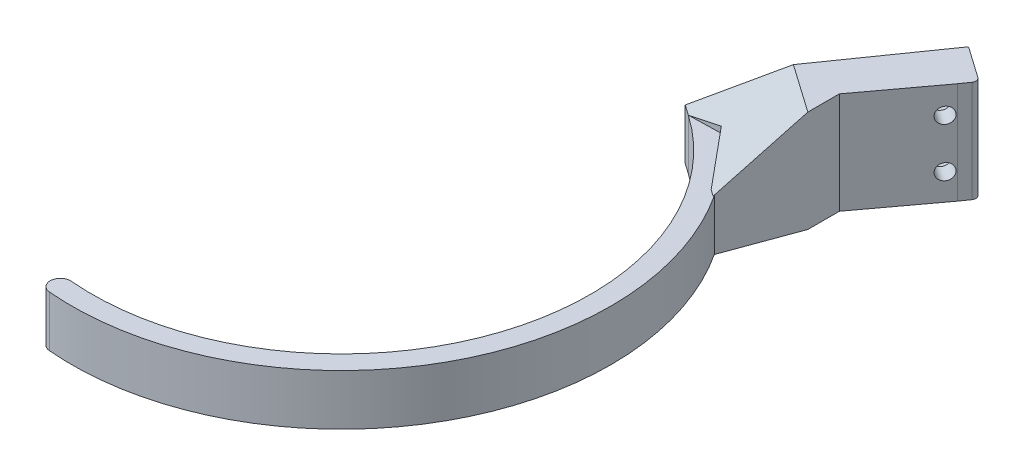
ISO-10303-21;
HEADER;
FILE_DESCRIPTION(('STEP AP214'),'2;1');
FILE_NAME('part.step','',(''),(''),'','','');
FILE_SCHEMA(('AUTOMOTIVE_DESIGN { 1 0 10303 214 1 1 1 1 }'));
ENDSEC;
DATA;
#1=APPLICATION_CONTEXT('core data for automotive mechanical design processes');
#2=APPLICATION_PROTOCOL_DEFINITION('international standard','automotive_design',2000,#1);
#3=PRODUCT_CONTEXT('',#1,'mechanical');
#4=PRODUCT('Part','Part','',(#3));
#5=PRODUCT_RELATED_PRODUCT_CATEGORY('part','',(#4));
#6=PRODUCT_DEFINITION_FORMATION('','',#4);
#7=PRODUCT_DEFINITION_CONTEXT('part definition',#1,'design');
#8=PRODUCT_DEFINITION('design','',#6,#7);
#9=PRODUCT_DEFINITION_SHAPE('','',#8);
#10=(LENGTH_UNIT() NAMED_UNIT(*) SI_UNIT(.MILLI.,.METRE.));
#11=(NAMED_UNIT(*) PLANE_ANGLE_UNIT() SI_UNIT($,.RADIAN.));
#12=(NAMED_UNIT(*) SI_UNIT($,.STERADIAN.) SOLID_ANGLE_UNIT());
#13=UNCERTAINTY_MEASURE_WITH_UNIT(LENGTH_MEASURE(1.E-05),#10,'distance_accuracy_value','');
#14=(GEOMETRIC_REPRESENTATION_CONTEXT(3) GLOBAL_UNCERTAINTY_ASSIGNED_CONTEXT((#13)) GLOBAL_UNIT_ASSIGNED_CONTEXT((#10,
#11,#12)) REPRESENTATION_CONTEXT('',''));
#15=CARTESIAN_POINT('',(0.,0.,0.));
#16=DIRECTION('',(0.,0.,1.));
#17=DIRECTION('',(1.,0.,0.));
#18=AXIS2_PLACEMENT_3D('',#15,#16,#17);
#19=CARTESIAN_POINT('',(-35.6590506865662,20.,33.3765795925225));
#20=DIRECTION('',(0.,-1.,0.));
#21=DIRECTION('',(0.,0.,-1.));
#22=AXIS2_PLACEMENT_3D('',#19,#20,#21);
#23=CYLINDRICAL_SURFACE('',#22,53.);
#24=DIRECTION('',(0.,1.,0.));
#25=VECTOR('',#24,1.);
#26=CARTESIAN_POINT('',(-40.2783050521928,5.,86.174898591385));
#27=LINE('',#26,#25);
#28=CARTESIAN_POINT('',(-40.2783050521928,5.,86.174898591385));
#29=VERTEX_POINT('',#28);
#30=CARTESIAN_POINT('',(-40.2783050521928,15.,86.174898591385));
#31=VERTEX_POINT('',#30);
#32=EDGE_CURVE('E246',#29,#31,#27,.T.);
#33=ORIENTED_EDGE('',*,*,#32,.F.);
#34=CARTESIAN_POINT('',(-35.6590506865662,5.,33.3765795925225));
#35=DIRECTION('',(0.,-1.,0.));
#36=DIRECTION('',(0.,0.,-1.));
#37=AXIS2_PLACEMENT_3D('',#34,#35,#36);
#38=CIRCLE('',#37,53.);
#39=CARTESIAN_POINT('',(8.66239189063403,5.,4.31440954491692));
#40=VERTEX_POINT('',#39);
#41=EDGE_CURVE('E298',#40,#29,#38,.T.);
#42=ORIENTED_EDGE('',*,*,#41,.F.);
#43=DIRECTION('',(0.,-1.,0.));
#44=VECTOR('',#43,1.);
#45=CARTESIAN_POINT('',(8.66239189063403,20.,4.31440954491692));
#46=LINE('',#45,#44);
#47=CARTESIAN_POINT('',(8.66239189063403,15.,4.31440954491692));
#48=VERTEX_POINT('',#47);
#49=EDGE_CURVE('E288',#40,#48,#46,.F.);
#50=ORIENTED_EDGE('',*,*,#49,.T.);
#51=CARTESIAN_POINT('',(-35.6590506865662,15.,33.3765795925225));
#52=DIRECTION('',(0.,1.,0.));
#53=DIRECTION('',(0.,0.,1.));
#54=AXIS2_PLACEMENT_3D('',#51,#52,#53);
#55=CIRCLE('',#54,53.);
#56=EDGE_CURVE('E236',#31,#48,#55,.T.);
#57=ORIENTED_EDGE('',*,*,#56,.F.);
#58=EDGE_LOOP('',(#33,#42,#50,#57));
#59=FACE_BOUND('',#58,.T.);
#60=ADVANCED_FACE('F40',(#59),#23,.T.);
#61=CARTESIAN_POINT('',(-4.09453098896801,20.,-3.03542202952052));
#62=DIRECTION('',(0.803328528906517,0.,0.595536123711141));
#63=DIRECTION('',(0.595536123711141,0.,-0.803328528906517));
#64=AXIS2_PLACEMENT_3D('',#61,#62,#63);
#65=PLANE('',#64);
#66=CARTESIAN_POINT('',(17.5125081050102,14.8,-32.1815144969696));
#67=DIRECTION('',(0.803328528906517,0.,0.595536123711141));
#68=DIRECTION('',(-0.595536123711141,0.,0.803328528906517));
#69=AXIS2_PLACEMENT_3D('',#66,#67,#68);
#70=ELLIPSE('',#69,1.55056798197377,1.55);
#71=CARTESIAN_POINT('',(16.5890888594749,14.8,-30.935899001041));
#72=VERTEX_POINT('',#71);
#73=EDGE_CURVE('E406',#72,#72,#70,.T.);
#74=ORIENTED_EDGE('',*,*,#73,.F.);
#75=EDGE_LOOP('',(#74));
#76=FACE_BOUND('',#75,.T.);
#77=CARTESIAN_POINT('',(17.5125081050102,5.2,-32.1815144969696));
#78=DIRECTION('',(0.803328528906517,0.,0.595536123711141));
#79=DIRECTION('',(-0.595536123711141,0.,0.803328528906517));
#80=AXIS2_PLACEMENT_3D('',#77,#78,#79);
#81=ELLIPSE('',#80,1.55056798197377,1.55);
#82=CARTESIAN_POINT('',(16.5890888594749,5.2,-30.935899001041));
#83=VERTEX_POINT('',#82);
#84=EDGE_CURVE('E403',#83,#83,#81,.T.);
#85=ORIENTED_EDGE('',*,*,#84,.F.);
#86=EDGE_LOOP('',(#85));
#87=FACE_BOUND('',#86,.T.);
#88=DIRECTION('',(-0.595536123711141,0.,0.803328528906517));
#89=VECTOR('',#88,1.);
#90=CARTESIAN_POINT('',(-4.09453098896801,20.,-3.03542202952052));
#91=LINE('',#90,#89);
#92=CARTESIAN_POINT('',(18.546430176255,20.,-33.5761890824863));
#93=VERTEX_POINT('',#92);
#94=CARTESIAN_POINT('',(8.66239189063403,20.,-20.2434463327033));
#95=VERTEX_POINT('',#94);
#96=EDGE_CURVE('E411',#93,#95,#91,.T.);
#97=ORIENTED_EDGE('',*,*,#96,.T.);
#98=DIRECTION('',(0.,-1.,0.));
#99=VECTOR('',#98,1.);
#100=CARTESIAN_POINT('',(8.66239189063403,20.,-20.2434463327033));
#101=LINE('',#100,#99);
#102=CARTESIAN_POINT('',(8.66239189063403,0.,-20.2434463327033));
#103=VERTEX_POINT('',#102);
#104=EDGE_CURVE('E282',#95,#103,#101,.T.);
#105=ORIENTED_EDGE('',*,*,#104,.T.);
#106=DIRECTION('',(-0.595536123711141,0.,0.803328528906517));
#107=VECTOR('',#106,1.);
#108=CARTESIAN_POINT('',(-4.09453098896801,0.,-3.03542202952052));
#109=LINE('',#108,#107);
#110=CARTESIAN_POINT('',(18.546430176255,0.,-33.5761890824863));
#111=VERTEX_POINT('',#110);
#112=EDGE_CURVE('E410',#111,#103,#109,.T.);
#113=ORIENTED_EDGE('',*,*,#112,.F.);
#114=DIRECTION('',(0.,-1.,0.));
#115=VECTOR('',#114,1.);
#116=CARTESIAN_POINT('',(18.546430176255,20.,-33.5761890824863));
#117=LINE('',#116,#115);
#118=EDGE_CURVE('E447',#93,#111,#117,.T.);
#119=ORIENTED_EDGE('',*,*,#118,.F.);
#120=EDGE_LOOP('',(#97,#105,#113,#119));
#121=FACE_BOUND('',#120,.T.);
#122=ADVANCED_FACE('F514',(#76,#87,#121),#65,.T.);
#123=CARTESIAN_POINT('',(0.,15.,0.));
#124=DIRECTION('',(0.,1.,0.));
#125=DIRECTION('',(0.,0.,1.));
#126=AXIS2_PLACEMENT_3D('',#123,#124,#125);
#127=PLANE('',#126);
#128=CARTESIAN_POINT('',(-35.6590506865662,15.,33.3765795925225));
#129=DIRECTION('',(0.,1.,0.));
#130=DIRECTION('',(0.,0.,1.));
#131=AXIS2_PLACEMENT_3D('',#128,#129,#130);
#132=CIRCLE('',#131,49.);
#133=CARTESIAN_POINT('',(-7.55380530536475,15.,-6.76187057763798));
#134=VERTEX_POINT('',#133);
#135=CARTESIAN_POINT('',(-39.9296820812021,15.,82.190119799018));
#136=VERTEX_POINT('',#135);
#137=EDGE_CURVE('E225',#134,#136,#132,.F.);
#138=ORIENTED_EDGE('',*,*,#137,.T.);
#139=CARTESIAN_POINT('',(-40.1039935666974,15.,84.1825091952015));
#140=DIRECTION('',(0.,1.,0.));
#141=DIRECTION('',(0.,0.,1.));
#142=AXIS2_PLACEMENT_3D('',#139,#140,#141);
#143=CIRCLE('',#142,2.00000000000001);
#144=EDGE_CURVE('E229',#136,#31,#143,.T.);
#145=ORIENTED_EDGE('',*,*,#144,.T.);
#146=ORIENTED_EDGE('',*,*,#56,.T.);
#147=DIRECTION('',(0.,0.,1.));
#148=VECTOR('',#147,1.);
#149=CARTESIAN_POINT('',(8.66239189063403,15.,0.));
#150=LINE('',#149,#148);
#151=CARTESIAN_POINT('',(8.66239189063403,15.,4.59283294009558));
#152=VERTEX_POINT('',#151);
#153=EDGE_CURVE('E291',#48,#152,#150,.T.);
#154=ORIENTED_EDGE('',*,*,#153,.T.);
#155=DIRECTION('',(-0.819152044288991,0.,-0.573576436351047));
#156=VECTOR('',#155,1.);
#157=CARTESIAN_POINT('',(14.9728759125825,15.,9.01148142201583));
#158=LINE('',#157,#156);
#159=CARTESIAN_POINT('',(7.38045740718294,15.,3.69521275129215));
#160=VERTEX_POINT('',#159);
#161=EDGE_CURVE('E55',#152,#160,#158,.T.);
#162=ORIENTED_EDGE('',*,*,#161,.T.);
#163=DIRECTION('',(-0.629921781981481,0.,-0.776658579161574));
#164=VECTOR('',#163,1.);
#165=CARTESIAN_POINT('',(2.64405690363652,15.,-2.14450606880203));
#166=LINE('',#165,#164);
#167=CARTESIAN_POINT('',(-1.22164639498694,15.,-6.91070358292033));
#168=VERTEX_POINT('',#167);
#169=EDGE_CURVE('E286',#160,#168,#166,.T.);
#170=ORIENTED_EDGE('',*,*,#169,.T.);
#171=DIRECTION('',(0.999723888181329,0.,-0.0234978169115014));
#172=VECTOR('',#171,1.);
#173=CARTESIAN_POINT('',(-0.163016139583997,15.,-6.93558595315527));
#174=LINE('',#173,#172);
#175=EDGE_CURVE('E232',#134,#168,#174,.T.);
#176=ORIENTED_EDGE('',*,*,#175,.F.);
#177=EDGE_LOOP('',(#138,#145,#146,#154,#162,#170,#176));
#178=FACE_BOUND('',#177,.T.);
#179=ADVANCED_FACE('F227',(#178),#127,.T.);
#180=CARTESIAN_POINT('',(0.,5.,0.));
#181=DIRECTION('',(0.,-1.,0.));
#182=DIRECTION('',(0.,0.,-1.));
#183=AXIS2_PLACEMENT_3D('',#180,#181,#182);
#184=PLANE('',#183);
#185=ORIENTED_EDGE('',*,*,#41,.T.);
#186=CARTESIAN_POINT('',(-40.1039935666974,5.,84.1825091952015));
#187=DIRECTION('',(0.,1.,0.));
#188=DIRECTION('',(0.,0.,1.));
#189=AXIS2_PLACEMENT_3D('',#186,#187,#188);
#190=CIRCLE('',#189,2.00000000000001);
#191=CARTESIAN_POINT('',(-39.9296820812021,5.,82.190119799018));
#192=VERTEX_POINT('',#191);
#193=EDGE_CURVE('E250',#192,#29,#190,.T.);
#194=ORIENTED_EDGE('',*,*,#193,.F.);
#195=CARTESIAN_POINT('',(-35.6590506865662,5.,33.3765795925225));
#196=DIRECTION('',(0.,-1.,0.));
#197=DIRECTION('',(0.,0.,-1.));
#198=AXIS2_PLACEMENT_3D('',#195,#196,#197);
#199=CIRCLE('',#198,49.);
#200=CARTESIAN_POINT('',(-7.55380530536477,5.,-6.76187057763798));
#201=VERTEX_POINT('',#200);
#202=EDGE_CURVE('E241',#192,#201,#199,.F.);
#203=ORIENTED_EDGE('',*,*,#202,.T.);
#204=DIRECTION('',(0.999723888181329,0.,-0.0234978169115014));
#205=VECTOR('',#204,1.);
#206=CARTESIAN_POINT('',(-0.163016139583997,5.,-6.93558595315527));
#207=LINE('',#206,#205);
#208=CARTESIAN_POINT('',(-1.22164639498694,5.,-6.91070358292033));
#209=VERTEX_POINT('',#208);
#210=EDGE_CURVE('E295',#201,#209,#207,.T.);
#211=ORIENTED_EDGE('',*,*,#210,.T.);
#212=DIRECTION('',(0.629921781981481,0.,0.776658579161574));
#213=VECTOR('',#212,1.);
#214=CARTESIAN_POINT('',(2.64405690363652,5.,-2.14450606880203));
#215=LINE('',#214,#213);
#216=CARTESIAN_POINT('',(7.38045740718295,5.,3.69521275129218));
#217=VERTEX_POINT('',#216);
#218=EDGE_CURVE('E453',#209,#217,#215,.T.);
#219=ORIENTED_EDGE('',*,*,#218,.T.);
#220=DIRECTION('',(-0.819152044288991,0.,-0.573576436351047));
#221=VECTOR('',#220,1.);
#222=CARTESIAN_POINT('',(14.9728759125825,5.,9.01148142201583));
#223=LINE('',#222,#221);
#224=CARTESIAN_POINT('',(8.66239189063403,5.,4.59283294009556));
#225=VERTEX_POINT('',#224);
#226=EDGE_CURVE('E62',#225,#217,#223,.T.);
#227=ORIENTED_EDGE('',*,*,#226,.F.);
#228=DIRECTION('',(0.,0.,-1.));
#229=VECTOR('',#228,1.);
#230=CARTESIAN_POINT('',(8.66239189063403,5.,0.));
#231=LINE('',#230,#229);
#232=EDGE_CURVE('E460',#225,#40,#231,.T.);
#233=ORIENTED_EDGE('',*,*,#232,.T.);
#234=EDGE_LOOP('',(#185,#194,#203,#211,#219,#227,#233));
#235=FACE_BOUND('',#234,.T.);
#236=ADVANCED_FACE('F466',(#235),#184,.T.);
#237=CARTESIAN_POINT('',(-35.6590506865662,20.,33.3765795925225));
#238=DIRECTION('',(0.,-1.,0.));
#239=DIRECTION('',(0.,0.,-1.));
#240=AXIS2_PLACEMENT_3D('',#237,#238,#239);
#241=CYLINDRICAL_SURFACE('',#240,49.);
#242=ORIENTED_EDGE('',*,*,#202,.F.);
#243=DIRECTION('',(0.,1.,0.));
#244=VECTOR('',#243,1.);
#245=CARTESIAN_POINT('',(-39.9296820812021,5.,82.190119799018));
#246=LINE('',#245,#244);
#247=EDGE_CURVE('E239',#192,#136,#246,.T.);
#248=ORIENTED_EDGE('',*,*,#247,.T.);
#249=ORIENTED_EDGE('',*,*,#137,.F.);
#250=DIRECTION('',(0.,-1.,0.));
#251=VECTOR('',#250,1.);
#252=CARTESIAN_POINT('',(-7.55380530536476,20.,-6.76187057763798));
#253=LINE('',#252,#251);
#254=EDGE_CURVE('E451',#134,#201,#253,.T.);
#255=ORIENTED_EDGE('',*,*,#254,.T.);
#256=EDGE_LOOP('',(#242,#248,#249,#255));
#257=FACE_BOUND('',#256,.T.);
#258=ADVANCED_FACE('F240',(#257),#241,.F.);
#259=CARTESIAN_POINT('',(0.,20.,0.));
#260=DIRECTION('',(0.,1.,0.));
#261=DIRECTION('',(0.,0.,1.));
#262=AXIS2_PLACEMENT_3D('',#259,#260,#261);
#263=PLANE('',#262);
#264=DIRECTION('',(-0.819152044288991,0.,-0.573576436351047));
#265=VECTOR('',#264,1.);
#266=CARTESIAN_POINT('',(23.7298547750207,20.,-3.49478048545804));
#267=LINE('',#266,#265);
#268=CARTESIAN_POINT('',(8.66239189063403,20.,-14.0451315788006));
#269=VERTEX_POINT('',#268);
#270=CARTESIAN_POINT('',(-0.84470655364904,20.,-20.7020735759895));
#271=VERTEX_POINT('',#270);
#272=EDGE_CURVE('E264',#269,#271,#267,.T.);
#273=ORIENTED_EDGE('',*,*,#272,.F.);
#274=DIRECTION('',(0.,0.,-1.));
#275=VECTOR('',#274,1.);
#276=CARTESIAN_POINT('',(8.66239189063403,20.,5.27576678668924));
#277=LINE('',#276,#275);
#278=EDGE_CURVE('E280',#269,#95,#277,.T.);
#279=ORIENTED_EDGE('',*,*,#278,.T.);
#280=ORIENTED_EDGE('',*,*,#96,.F.);
#281=DIRECTION('',(-0.573576436351048,0.,0.819152044288991));
#282=VECTOR('',#281,1.);
#283=CARTESIAN_POINT('',(-3.33080711580383,20.,-2.33225625080839));
#284=LINE('',#283,#282);
#285=CARTESIAN_POINT('',(19.7305879780601,20.,-35.2673416868023));
#286=VERTEX_POINT('',#285);
#287=EDGE_CURVE('E414',#286,#93,#284,.T.);
#288=ORIENTED_EDGE('',*,*,#287,.F.);
#289=CARTESIAN_POINT('',(18.9114359337711,20.,-35.8409181231534));
#290=DIRECTION('',(0.,1.,0.));
#291=DIRECTION('',(0.,0.,1.));
#292=AXIS2_PLACEMENT_3D('',#289,#290,#291);
#293=CIRCLE('',#292,1.00000000000001);
#294=CARTESIAN_POINT('',(19.4850123701221,20.,-36.6600701674424));
#295=VERTEX_POINT('',#294);
#296=EDGE_CURVE('E418',#286,#295,#293,.T.);
#297=ORIENTED_EDGE('',*,*,#296,.T.);
#298=DIRECTION('',(0.819152044288992,0.,0.573576436351046));
#299=VECTOR('',#298,1.);
#300=CARTESIAN_POINT('',(23.6349715302149,20.,-33.754237480283));
#301=LINE('',#300,#299);
#302=CARTESIAN_POINT('',(13.3413720379547,20.,-40.9618934400752));
#303=VERTEX_POINT('',#302);
#304=EDGE_CURVE('E420',#303,#295,#301,.T.);
#305=ORIENTED_EDGE('',*,*,#304,.F.);
#306=DIRECTION('',(0.573576436351047,0.,-0.819152044288991));
#307=VECTOR('',#306,1.);
#308=CARTESIAN_POINT('',(-10.2935994922602,20.,-7.20765595979227));
#309=LINE('',#308,#307);
#310=EDGE_CURVE('E423',#271,#303,#309,.T.);
#311=ORIENTED_EDGE('',*,*,#310,.F.);
#312=EDGE_LOOP('',(#273,#279,#280,#288,#297,#305,#311));
#313=FACE_BOUND('',#312,.T.);
#314=ADVANCED_FACE('F499',(#313),#263,.T.);
#315=CARTESIAN_POINT('',(18.7797255863596,5.2,-31.2941992639775));
#316=DIRECTION('',(-0.819152044288989,0.,-0.57357643635105));
#317=DIRECTION('',(-0.57357643635105,0.,0.819152044288989));
#318=AXIS2_PLACEMENT_3D('',#315,#316,#317);
#319=CYLINDRICAL_SURFACE('',#318,1.55);
#320=ORIENTED_EDGE('',*,*,#84,.T.);
#321=EDGE_LOOP('',(#320));
#322=FACE_BOUND('',#321,.T.);
#323=CARTESIAN_POINT('',(14.6839653649147,5.2,-34.1620814457328));
#324=DIRECTION('',(-0.819152044288989,0.,-0.57357643635105));
#325=DIRECTION('',(-0.57357643635105,0.,0.819152044288989));
#326=AXIS2_PLACEMENT_3D('',#323,#324,#325);
#327=CIRCLE('',#326,1.55);
#328=CARTESIAN_POINT('',(13.7949218885706,5.2,-32.8923957770848));
#329=VERTEX_POINT('',#328);
#330=EDGE_CURVE('E407',#329,#329,#327,.F.);
#331=ORIENTED_EDGE('',*,*,#330,.F.);
#332=EDGE_LOOP('',(#331));
#333=FACE_BOUND('',#332,.T.);
#334=ADVANCED_FACE('F533',(#322,#333),#319,.F.);
#335=CARTESIAN_POINT('',(18.7797255863596,14.8,-31.2941992639775));
#336=DIRECTION('',(-0.819152044288989,0.,-0.57357643635105));
#337=DIRECTION('',(-0.57357643635105,0.,0.819152044288989));
#338=AXIS2_PLACEMENT_3D('',#335,#336,#337);
#339=CYLINDRICAL_SURFACE('',#338,1.55);
#340=ORIENTED_EDGE('',*,*,#73,.T.);
#341=EDGE_LOOP('',(#340));
#342=FACE_BOUND('',#341,.T.);
#343=CARTESIAN_POINT('',(14.6839653649147,14.8,-34.1620814457328));
#344=DIRECTION('',(-0.819152044288988,0.,-0.573576436351051));
#345=DIRECTION('',(-0.573576436351051,0.,0.819152044288989));
#346=AXIS2_PLACEMENT_3D('',#343,#344,#345);
#347=CIRCLE('',#346,1.55);
#348=CARTESIAN_POINT('',(13.7949218885706,14.8,-32.8923957770848));
#349=VERTEX_POINT('',#348);
#350=EDGE_CURVE('E346',#349,#349,#347,.F.);
#351=ORIENTED_EDGE('',*,*,#350,.F.);
#352=EDGE_LOOP('',(#351));
#353=FACE_BOUND('',#352,.T.);
#354=ADVANCED_FACE('F604',(#342,#353),#339,.F.);
#355=CARTESIAN_POINT('',(0.691914076173,20.,-0.988155708723271));
#356=DIRECTION('',(-0.57357643635105,0.,0.819152044288989));
#357=DIRECTION('',(0.819152044288989,0.,0.57357643635105));
#358=AXIS2_PLACEMENT_3D('',#355,#356,#357);
#359=PLANE('',#358);
#360=CARTESIAN_POINT('',(-9.60168541608721,5.,-8.19581166851558));
#361=VERTEX_POINT('',#360);
#362=EDGE_CURVE('E257',#201,#361,#223,.T.);
#363=ORIENTED_EDGE('',*,*,#362,.F.);
#364=ORIENTED_EDGE('',*,*,#254,.F.);
#365=CARTESIAN_POINT('',(-9.60168541608722,15.,-8.19581166851558));
#366=VERTEX_POINT('',#365);
#367=EDGE_CURVE('E265',#134,#366,#158,.T.);
#368=ORIENTED_EDGE('',*,*,#367,.T.);
#369=DIRECTION('',(0.,-1.,0.));
#370=VECTOR('',#369,1.);
#371=CARTESIAN_POINT('',(-9.60168541608721,20.,-8.19581166851558));
#372=LINE('',#371,#370);
#373=EDGE_CURVE('E425',#366,#361,#372,.T.);
#374=ORIENTED_EDGE('',*,*,#373,.T.);
#375=EDGE_LOOP('',(#363,#364,#368,#374));
#376=FACE_BOUND('',#375,.T.);
#377=ADVANCED_FACE('F42',(#376),#359,.T.);
#378=CARTESIAN_POINT('',(-3.33080711580383,20.,-2.33225625080839));
#379=DIRECTION('',(0.819152044288991,0.,0.573576436351048));
#380=DIRECTION('',(0.573576436351048,0.,-0.819152044288991));
#381=AXIS2_PLACEMENT_3D('',#378,#379,#380);
#382=PLANE('',#381);
#383=DIRECTION('',(-0.573576436351048,0.,0.819152044288991));
#384=VECTOR('',#383,1.);
#385=CARTESIAN_POINT('',(-3.33080711580383,0.,-2.33225625080839));
#386=LINE('',#385,#384);
#387=CARTESIAN_POINT('',(19.7305879780601,0.,-35.2673416868023));
#388=VERTEX_POINT('',#387);
#389=EDGE_CURVE('E428',#388,#111,#386,.T.);
#390=ORIENTED_EDGE('',*,*,#389,.F.);
#391=DIRECTION('',(0.,-1.,0.));
#392=VECTOR('',#391,1.);
#393=CARTESIAN_POINT('',(19.7305879780601,20.,-35.2673416868023));
#394=LINE('',#393,#392);
#395=EDGE_CURVE('E445',#286,#388,#394,.T.);
#396=ORIENTED_EDGE('',*,*,#395,.F.);
#397=ORIENTED_EDGE('',*,*,#287,.T.);
#398=ORIENTED_EDGE('',*,*,#118,.T.);
#399=EDGE_LOOP('',(#390,#396,#397,#398));
#400=FACE_BOUND('',#399,.T.);
#401=ADVANCED_FACE('F510',(#400),#382,.T.);
#402=CARTESIAN_POINT('',(18.9114359337711,20.,-35.8409181231534));
#403=DIRECTION('',(0.,-1.,0.));
#404=DIRECTION('',(0.,0.,-1.));
#405=AXIS2_PLACEMENT_3D('',#402,#403,#404);
#406=CYLINDRICAL_SURFACE('',#405,1.00000000000001);
#407=CARTESIAN_POINT('',(18.9114359337711,0.,-35.8409181231534));
#408=DIRECTION('',(0.,1.,0.));
#409=DIRECTION('',(0.,0.,1.));
#410=AXIS2_PLACEMENT_3D('',#407,#408,#409);
#411=CIRCLE('',#410,1.00000000000001);
#412=CARTESIAN_POINT('',(19.4850123701221,0.,-36.6600701674424));
#413=VERTEX_POINT('',#412);
#414=EDGE_CURVE('E431',#388,#413,#411,.T.);
#415=ORIENTED_EDGE('',*,*,#414,.T.);
#416=DIRECTION('',(0.,-1.,0.));
#417=VECTOR('',#416,1.);
#418=CARTESIAN_POINT('',(19.4850123701221,20.,-36.6600701674424));
#419=LINE('',#418,#417);
#420=EDGE_CURVE('E443',#295,#413,#419,.T.);
#421=ORIENTED_EDGE('',*,*,#420,.F.);
#422=ORIENTED_EDGE('',*,*,#296,.F.);
#423=ORIENTED_EDGE('',*,*,#395,.T.);
#424=EDGE_LOOP('',(#415,#421,#422,#423));
#425=FACE_BOUND('',#424,.T.);
#426=ADVANCED_FACE('F507',(#425),#406,.T.);
#427=CARTESIAN_POINT('',(23.6349715302149,20.,-33.754237480283));
#428=DIRECTION('',(0.573576436351046,0.,-0.819152044288992));
#429=DIRECTION('',(-0.819152044288992,0.,-0.573576436351046));
#430=AXIS2_PLACEMENT_3D('',#427,#428,#429);
#431=PLANE('',#430);
#432=DIRECTION('',(0.819152044288992,0.,0.573576436351046));
#433=VECTOR('',#432,1.);
#434=CARTESIAN_POINT('',(23.6349715302149,0.,-33.754237480283));
#435=LINE('',#434,#433);
#436=CARTESIAN_POINT('',(13.3413720379547,0.,-40.9618934400752));
#437=VERTEX_POINT('',#436);
#438=EDGE_CURVE('E434',#437,#413,#435,.T.);
#439=ORIENTED_EDGE('',*,*,#438,.F.);
#440=DIRECTION('',(0.,-1.,0.));
#441=VECTOR('',#440,1.);
#442=CARTESIAN_POINT('',(13.3413720379547,20.,-40.9618934400752));
#443=LINE('',#442,#441);
#444=EDGE_CURVE('E440',#303,#437,#443,.T.);
#445=ORIENTED_EDGE('',*,*,#444,.F.);
#446=ORIENTED_EDGE('',*,*,#304,.T.);
#447=ORIENTED_EDGE('',*,*,#420,.T.);
#448=EDGE_LOOP('',(#439,#445,#446,#447));
#449=FACE_BOUND('',#448,.T.);
#450=ADVANCED_FACE('F503',(#449),#431,.T.);
#451=CARTESIAN_POINT('',(-10.2935994922602,20.,-7.20765595979227));
#452=DIRECTION('',(-0.819152044288991,0.,-0.573576436351047));
#453=DIRECTION('',(-0.573576436351047,0.,0.819152044288991));
#454=AXIS2_PLACEMENT_3D('',#451,#452,#453);
#455=PLANE('',#454);
#456=DIRECTION('',(0.545089288329424,-0.311231360091268,-0.778468180624142));
#457=VECTOR('',#456,1.);
#458=CARTESIAN_POINT('',(-9.60168541608721,5.,-8.19581166851558));
#459=LINE('',#458,#457);
#460=CARTESIAN_POINT('',(-0.84470655364904,0.,-20.7020735759895));
#461=VERTEX_POINT('',#460);
#462=EDGE_CURVE('E255',#361,#461,#459,.T.);
#463=ORIENTED_EDGE('',*,*,#462,.F.);
#464=ORIENTED_EDGE('',*,*,#373,.F.);
#465=DIRECTION('',(-0.545089288329424,-0.311231360091268,0.778468180624142));
#466=VECTOR('',#465,1.);
#467=CARTESIAN_POINT('',(-0.84470655364904,20.,-20.7020735759895));
#468=LINE('',#467,#466);
#469=EDGE_CURVE('E245',#271,#366,#468,.T.);
#470=ORIENTED_EDGE('',*,*,#469,.F.);
#471=ORIENTED_EDGE('',*,*,#310,.T.);
#472=ORIENTED_EDGE('',*,*,#444,.T.);
#473=DIRECTION('',(0.573576436351047,0.,-0.819152044288991));
#474=VECTOR('',#473,1.);
#475=CARTESIAN_POINT('',(-10.2935994922602,0.,-7.20765595979227));
#476=LINE('',#475,#474);
#477=EDGE_CURVE('E415',#461,#437,#476,.T.);
#478=ORIENTED_EDGE('',*,*,#477,.F.);
#479=EDGE_LOOP('',(#463,#464,#470,#471,#472,#478));
#480=FACE_BOUND('',#479,.T.);
#481=DIRECTION('',(0.284710773941321,0.868106442342096,-0.4066091243023));
#482=VECTOR('',#481,1.);
#483=CARTESIAN_POINT('',(8.63441058090264,14.7857709650892,-34.2396558173742));
#484=LINE('',#483,#482);
#485=CARTESIAN_POINT('',(8.63441058090264,14.7857709650892,-34.2396558173742));
#486=VERTEX_POINT('',#485);
#487=CARTESIAN_POINT('',(9.60423984856227,17.7428597453008,-35.6247155528627));
#488=VERTEX_POINT('',#487);
#489=EDGE_CURVE('E327',#486,#488,#484,.T.);
#490=ORIENTED_EDGE('',*,*,#489,.F.);
#491=DIRECTION('',(-0.288860658248181,0.863929253967843,0.412535773303352));
#492=VECTOR('',#491,1.);
#493=CARTESIAN_POINT('',(9.61837587581013,11.8429112197884,-35.6449038919998));
#494=LINE('',#493,#492);
#495=CARTESIAN_POINT('',(9.61837587581013,11.8429112197884,-35.6449038919998));
#496=VERTEX_POINT('',#495);
#497=EDGE_CURVE('E311',#496,#486,#494,.T.);
#498=ORIENTED_EDGE('',*,*,#497,.F.);
#499=DIRECTION('',(-0.573571432189502,-0.00417718837425328,0.819144897605649));
#500=VECTOR('',#499,1.);
#501=CARTESIAN_POINT('',(11.5721704383773,11.8571402546992,-38.4352117021135));
#502=LINE('',#501,#500);
#503=CARTESIAN_POINT('',(11.5721704383773,11.8571402546992,-38.4352117021135));
#504=VERTEX_POINT('',#503);
#505=EDGE_CURVE('E339',#504,#496,#502,.T.);
#506=ORIENTED_EDGE('',*,*,#505,.F.);
#507=DIRECTION('',(-0.284710773941321,-0.868106442342096,0.4066091243023));
#508=VECTOR('',#507,1.);
#509=CARTESIAN_POINT('',(12.5419997060369,14.8142290349107,-39.8202714376018));
#510=LINE('',#509,#508);
#511=CARTESIAN_POINT('',(12.5419997060369,14.8142290349107,-39.8202714376018));
#512=VERTEX_POINT('',#511);
#513=EDGE_CURVE('E336',#512,#504,#510,.T.);
#514=ORIENTED_EDGE('',*,*,#513,.F.);
#515=DIRECTION('',(0.28886065824818,-0.863929253967843,-0.412535773303352));
#516=VECTOR('',#515,1.);
#517=CARTESIAN_POINT('',(11.5580344111294,17.7570887802116,-38.4150233629763));
#518=LINE('',#517,#516);
#519=CARTESIAN_POINT('',(11.5580344111294,17.7570887802116,-38.4150233629763));
#520=VERTEX_POINT('',#519);
#521=EDGE_CURVE('E333',#520,#512,#518,.T.);
#522=ORIENTED_EDGE('',*,*,#521,.F.);
#523=DIRECTION('',(0.573571432189503,0.00417718837425328,-0.819144897605649));
#524=VECTOR('',#523,1.);
#525=CARTESIAN_POINT('',(9.60423984856227,17.7428597453008,-35.6247155528625));
#526=LINE('',#525,#524);
#527=EDGE_CURVE('E329',#488,#520,#526,.T.);
#528=ORIENTED_EDGE('',*,*,#527,.F.);
#529=EDGE_LOOP('',(#490,#498,#506,#514,#522,#528));
#530=FACE_BOUND('',#529,.T.);
#531=DIRECTION('',(0.302165866959618,0.849983002989528,-0.431537580603876));
#532=VECTOR('',#531,1.);
#533=CARTESIAN_POINT('',(8.63534713246366,5.3064129808969,-34.2409933516193));
#534=LINE('',#533,#532);
#535=CARTESIAN_POINT('',(8.63534713246366,5.3064129808969,-34.2409933516193));
#536=VERTEX_POINT('',#535);
#537=CARTESIAN_POINT('',(9.66463484577507,8.20176668283428,-35.7109685477493));
#538=VERTEX_POINT('',#537);
#539=EDGE_CURVE('E330',#536,#538,#534,.T.);
#540=ORIENTED_EDGE('',*,*,#539,.F.);
#541=DIRECTION('',(-0.271130623723516,0.881222441887542,0.387214659837478));
#542=VECTOR('',#541,1.);
#543=CARTESIAN_POINT('',(9.55891743015836,2.30464629806261,-35.5599884313582));
#544=LINE('',#543,#542);
#545=CARTESIAN_POINT('',(9.55891743015836,2.30464629806261,-35.5599884313582));
#546=VERTEX_POINT('',#545);
#547=EDGE_CURVE('E370',#546,#536,#544,.T.);
#548=ORIENTED_EDGE('',*,*,#547,.F.);
#549=DIRECTION('',(-0.573296490683131,0.0312394388980172,0.818752240441358));
#550=VECTOR('',#549,1.);
#551=CARTESIAN_POINT('',(11.5117754411645,2.1982333171657,-38.3489587072269));
#552=LINE('',#551,#550);
#553=CARTESIAN_POINT('',(11.5117754411645,2.1982333171657,-38.3489587072269));
#554=VERTEX_POINT('',#553);
#555=EDGE_CURVE('E373',#554,#546,#552,.T.);
#556=ORIENTED_EDGE('',*,*,#555,.F.);
#557=DIRECTION('',(-0.302165866959618,-0.849983002989527,0.431537580603877));
#558=VECTOR('',#557,1.);
#559=CARTESIAN_POINT('',(12.5410631544759,5.0935870191031,-39.8189339033567));
#560=LINE('',#559,#558);
#561=CARTESIAN_POINT('',(12.5410631544759,5.0935870191031,-39.8189339033567));
#562=VERTEX_POINT('',#561);
#563=EDGE_CURVE('E377',#562,#554,#560,.T.);
#564=ORIENTED_EDGE('',*,*,#563,.F.);
#565=DIRECTION('',(0.271130623723514,-0.881222441887543,-0.387214659837479));
#566=VECTOR('',#565,1.);
#567=CARTESIAN_POINT('',(11.6174928567812,8.09535370193739,-38.4999388236178));
#568=LINE('',#567,#566);
#569=CARTESIAN_POINT('',(11.6174928567812,8.09535370193739,-38.4999388236178));
#570=VERTEX_POINT('',#569);
#571=EDGE_CURVE('E380',#570,#562,#568,.T.);
#572=ORIENTED_EDGE('',*,*,#571,.F.);
#573=DIRECTION('',(0.573296490683133,-0.0312394388980139,-0.818752240441357));
#574=VECTOR('',#573,1.);
#575=CARTESIAN_POINT('',(9.66463484577507,8.20176668283429,-35.7109685477491));
#576=LINE('',#575,#574);
#577=EDGE_CURVE('E383',#538,#570,#576,.T.);
#578=ORIENTED_EDGE('',*,*,#577,.F.);
#579=EDGE_LOOP('',(#540,#548,#556,#564,#572,#578));
#580=FACE_BOUND('',#579,.T.);
#581=ADVANCED_FACE('F478',(#480,#530,#580),#455,.T.);
#582=CARTESIAN_POINT('',(0.,0.,0.));
#583=DIRECTION('',(0.,1.,0.));
#584=DIRECTION('',(0.,0.,1.));
#585=AXIS2_PLACEMENT_3D('',#582,#583,#584);
#586=PLANE('',#585);
#587=DIRECTION('',(0.,0.,-1.));
#588=VECTOR('',#587,1.);
#589=CARTESIAN_POINT('',(8.66239189063403,0.,5.27576678668924));
#590=LINE('',#589,#588);
#591=CARTESIAN_POINT('',(8.66239189063403,0.,-14.0451315788006));
#592=VERTEX_POINT('',#591);
#593=EDGE_CURVE('E279',#592,#103,#590,.T.);
#594=ORIENTED_EDGE('',*,*,#593,.F.);
#595=DIRECTION('',(-0.819152044288991,0.,-0.573576436351047));
#596=VECTOR('',#595,1.);
#597=CARTESIAN_POINT('',(23.7298547750207,0.,-3.49478048545804));
#598=LINE('',#597,#596);
#599=EDGE_CURVE('E258',#592,#461,#598,.T.);
#600=ORIENTED_EDGE('',*,*,#599,.T.);
#601=ORIENTED_EDGE('',*,*,#477,.T.);
#602=ORIENTED_EDGE('',*,*,#438,.T.);
#603=ORIENTED_EDGE('',*,*,#414,.F.);
#604=ORIENTED_EDGE('',*,*,#389,.T.);
#605=ORIENTED_EDGE('',*,*,#112,.T.);
#606=EDGE_LOOP('',(#594,#600,#601,#602,#603,#604,#605));
#607=FACE_BOUND('',#606,.T.);
#608=ADVANCED_FACE('F485',(#607),#586,.F.);
#609=CARTESIAN_POINT('',(-6.19783927081526,0.,-4.33977377803707));
#610=DIRECTION('',(-0.819152044288988,0.,-0.573576436351051));
#611=DIRECTION('',(-0.573576436351051,0.,0.819152044288989));
#612=AXIS2_PLACEMENT_3D('',#609,#610,#611);
#613=PLANE('',#612);
#614=DIRECTION('',(0.284710773941321,0.868106442342096,-0.4066091243023));
#615=VECTOR('',#614,1.);
#616=CARTESIAN_POINT('',(12.7301708023476,14.7857709650892,-31.371773635619));
#617=LINE('',#616,#615);
#618=CARTESIAN_POINT('',(12.7301708023476,14.7857709650892,-31.371773635619));
#619=VERTEX_POINT('',#618);
#620=CARTESIAN_POINT('',(13.7000000700072,17.7428597453008,-32.7568333711072));
#621=VERTEX_POINT('',#620);
#622=EDGE_CURVE('E307',#619,#621,#617,.T.);
#623=ORIENTED_EDGE('',*,*,#622,.T.);
#624=DIRECTION('',(0.573571432189503,0.00417718837425328,-0.819144897605649));
#625=VECTOR('',#624,1.);
#626=CARTESIAN_POINT('',(13.7000000700072,17.7428597453008,-32.7568333711072));
#627=LINE('',#626,#625);
#628=CARTESIAN_POINT('',(15.6537946325743,17.7570887802116,-35.547141181221));
#629=VERTEX_POINT('',#628);
#630=EDGE_CURVE('E310',#621,#629,#627,.T.);
#631=ORIENTED_EDGE('',*,*,#630,.T.);
#632=DIRECTION('',(0.28886065824818,-0.863929253967843,-0.412535773303352));
#633=VECTOR('',#632,1.);
#634=CARTESIAN_POINT('',(15.6537946325743,17.7570887802116,-35.547141181221));
#635=LINE('',#634,#633);
#636=CARTESIAN_POINT('',(16.6377599274818,14.8142290349107,-36.9523892558466));
#637=VERTEX_POINT('',#636);
#638=EDGE_CURVE('E314',#629,#637,#635,.T.);
#639=ORIENTED_EDGE('',*,*,#638,.T.);
#640=DIRECTION('',(-0.284710773941321,-0.868106442342096,0.4066091243023));
#641=VECTOR('',#640,1.);
#642=CARTESIAN_POINT('',(16.6377599274818,14.8142290349107,-36.9523892558466));
#643=LINE('',#642,#641);
#644=CARTESIAN_POINT('',(15.6679306598222,11.8571402546992,-35.5673295203583));
#645=VERTEX_POINT('',#644);
#646=EDGE_CURVE('E317',#637,#645,#643,.T.);
#647=ORIENTED_EDGE('',*,*,#646,.T.);
#648=DIRECTION('',(-0.573571432189502,-0.00417718837425328,0.819144897605649));
#649=VECTOR('',#648,1.);
#650=CARTESIAN_POINT('',(15.6679306598222,11.8571402546992,-35.5673295203583));
#651=LINE('',#650,#649);
#652=CARTESIAN_POINT('',(13.7141360972551,11.8429112197884,-32.7770217102445));
#653=VERTEX_POINT('',#652);
#654=EDGE_CURVE('E320',#645,#653,#651,.T.);
#655=ORIENTED_EDGE('',*,*,#654,.T.);
#656=DIRECTION('',(-0.288860658248181,0.863929253967843,0.412535773303352));
#657=VECTOR('',#656,1.);
#658=CARTESIAN_POINT('',(13.7141360972551,11.8429112197884,-32.7770217102445));
#659=LINE('',#658,#657);
#660=EDGE_CURVE('E323',#653,#619,#659,.T.);
#661=ORIENTED_EDGE('',*,*,#660,.T.);
#662=EDGE_LOOP('',(#623,#631,#639,#647,#655,#661));
#663=FACE_BOUND('',#662,.T.);
#664=ORIENTED_EDGE('',*,*,#350,.T.);
#665=EDGE_LOOP('',(#664));
#666=FACE_BOUND('',#665,.T.);
#667=ADVANCED_FACE('F549',(#663,#666),#613,.T.);
#668=CARTESIAN_POINT('',(12.7301708023476,14.7857709650892,-31.371773635619));
#669=DIRECTION('',(-0.497925399571968,0.496378086506797,0.711111166904969));
#670=DIRECTION('',(0.819152044288989,0.,0.57357643635105));
#671=AXIS2_PLACEMENT_3D('',#668,#669,#670);
#672=PLANE('',#671);
#673=ORIENTED_EDGE('',*,*,#489,.T.);
#674=DIRECTION('',(-0.819152044288989,0.,-0.57357643635105));
#675=VECTOR('',#674,1.);
#676=CARTESIAN_POINT('',(13.7000000700072,17.7428597453008,-32.7568333711072));
#677=LINE('',#676,#675);
#678=EDGE_CURVE('E326',#621,#488,#677,.T.);
#679=ORIENTED_EDGE('',*,*,#678,.F.);
#680=ORIENTED_EDGE('',*,*,#622,.F.);
#681=DIRECTION('',(-0.819152044288989,0.,-0.57357643635105));
#682=VECTOR('',#681,1.);
#683=CARTESIAN_POINT('',(12.7301708023476,14.7857709650892,-31.371773635619));
#684=LINE('',#683,#682);
#685=EDGE_CURVE('E344',#619,#486,#684,.T.);
#686=ORIENTED_EDGE('',*,*,#685,.T.);
#687=EDGE_LOOP('',(#673,#679,#680,#686));
#688=FACE_BOUND('',#687,.T.);
#689=ADVANCED_FACE('F552',(#688),#672,.F.);
#690=CARTESIAN_POINT('',(13.7141360972551,11.8429112197884,-32.7770217102445));
#691=DIRECTION('',(-0.495529462750297,-0.50361318900379,0.70768941450882));
#692=DIRECTION('',(0.,-0.814755515988675,-0.57980466466391));
#693=AXIS2_PLACEMENT_3D('',#690,#691,#692);
#694=PLANE('',#693);
#695=ORIENTED_EDGE('',*,*,#497,.T.);
#696=ORIENTED_EDGE('',*,*,#685,.F.);
#697=ORIENTED_EDGE('',*,*,#660,.F.);
#698=DIRECTION('',(-0.819152044288989,0.,-0.57357643635105));
#699=VECTOR('',#698,1.);
#700=CARTESIAN_POINT('',(13.7141360972551,11.8429112197884,-32.7770217102445));
#701=LINE('',#700,#699);
#702=EDGE_CURVE('E347',#653,#496,#701,.T.);
#703=ORIENTED_EDGE('',*,*,#702,.T.);
#704=EDGE_LOOP('',(#695,#696,#697,#703));
#705=FACE_BOUND('',#704,.T.);
#706=ADVANCED_FACE('F554',(#705),#694,.F.);
#707=CARTESIAN_POINT('',(15.6679306598222,11.8571402546992,-35.5673295203583));
#708=DIRECTION('',(0.00239593682167123,-0.999991275510585,-0.00342175239614977));
#709=DIRECTION('',(0.,0.00342176221749955,-0.999994145754527));
#710=AXIS2_PLACEMENT_3D('',#707,#708,#709);
#711=PLANE('',#710);
#712=ORIENTED_EDGE('',*,*,#505,.T.);
#713=ORIENTED_EDGE('',*,*,#702,.F.);
#714=ORIENTED_EDGE('',*,*,#654,.F.);
#715=DIRECTION('',(-0.819152044288989,0.,-0.57357643635105));
#716=VECTOR('',#715,1.);
#717=CARTESIAN_POINT('',(15.6679306598222,11.8571402546992,-35.5673295203583));
#718=LINE('',#717,#716);
#719=EDGE_CURVE('E349',#645,#504,#718,.T.);
#720=ORIENTED_EDGE('',*,*,#719,.T.);
#721=EDGE_LOOP('',(#712,#713,#714,#720));
#722=FACE_BOUND('',#721,.T.);
#723=ADVANCED_FACE('F557',(#722),#711,.F.);
#724=CARTESIAN_POINT('',(16.6377599274818,14.8142290349107,-36.9523892558466));
#725=DIRECTION('',(0.497925399571968,-0.496378086506797,-0.711111166904969));
#726=DIRECTION('',(-0.819152044288989,0.,-0.57357643635105));
#727=AXIS2_PLACEMENT_3D('',#724,#725,#726);
#728=PLANE('',#727);
#729=ORIENTED_EDGE('',*,*,#513,.T.);
#730=ORIENTED_EDGE('',*,*,#719,.F.);
#731=ORIENTED_EDGE('',*,*,#646,.F.);
#732=DIRECTION('',(-0.819152044288989,0.,-0.57357643635105));
#733=VECTOR('',#732,1.);
#734=CARTESIAN_POINT('',(16.6377599274818,14.8142290349107,-36.9523892558466));
#735=LINE('',#734,#733);
#736=EDGE_CURVE('E351',#637,#512,#735,.T.);
#737=ORIENTED_EDGE('',*,*,#736,.T.);
#738=EDGE_LOOP('',(#729,#730,#731,#737));
#739=FACE_BOUND('',#738,.T.);
#740=ADVANCED_FACE('F561',(#739),#728,.F.);
#741=CARTESIAN_POINT('',(15.6537946325743,17.7570887802116,-35.547141181221));
#742=DIRECTION('',(0.495529462750297,0.503613189003789,-0.70768941450882));
#743=DIRECTION('',(0.,0.814755515988675,0.579804664663909));
#744=AXIS2_PLACEMENT_3D('',#741,#742,#743);
#745=PLANE('',#744);
#746=ORIENTED_EDGE('',*,*,#521,.T.);
#747=ORIENTED_EDGE('',*,*,#736,.F.);
#748=ORIENTED_EDGE('',*,*,#638,.F.);
#749=DIRECTION('',(-0.819152044288989,0.,-0.57357643635105));
#750=VECTOR('',#749,1.);
#751=CARTESIAN_POINT('',(15.6537946325743,17.7570887802116,-35.547141181221));
#752=LINE('',#751,#750);
#753=EDGE_CURVE('E353',#629,#520,#752,.T.);
#754=ORIENTED_EDGE('',*,*,#753,.T.);
#755=EDGE_LOOP('',(#746,#747,#748,#754));
#756=FACE_BOUND('',#755,.T.);
#757=ADVANCED_FACE('F565',(#756),#745,.F.);
#758=CARTESIAN_POINT('',(13.7000000700072,17.7428597453008,-32.7568333711072));
#759=DIRECTION('',(-0.00239593682167123,0.999991275510585,0.00342175239614977));
#760=DIRECTION('',(0.,-0.00342176221749955,0.999994145754527));
#761=AXIS2_PLACEMENT_3D('',#758,#759,#760);
#762=PLANE('',#761);
#763=ORIENTED_EDGE('',*,*,#527,.T.);
#764=ORIENTED_EDGE('',*,*,#753,.F.);
#765=ORIENTED_EDGE('',*,*,#630,.F.);
#766=ORIENTED_EDGE('',*,*,#678,.T.);
#767=EDGE_LOOP('',(#763,#764,#765,#766));
#768=FACE_BOUND('',#767,.T.);
#769=ADVANCED_FACE('F569',(#768),#762,.F.);
#770=CARTESIAN_POINT('',(-6.19783927081526,0.,-4.33977377803706));
#771=DIRECTION('',(-0.819152044288989,0.,-0.57357643635105));
#772=DIRECTION('',(-0.57357643635105,0.,0.819152044288989));
#773=AXIS2_PLACEMENT_3D('',#770,#771,#772);
#774=PLANE('',#773);
#775=DIRECTION('',(0.302165866959618,0.849983002989528,-0.431537580603876));
#776=VECTOR('',#775,1.);
#777=CARTESIAN_POINT('',(12.7311073539086,5.3064129808969,-31.3731111698641));
#778=LINE('',#777,#776);
#779=CARTESIAN_POINT('',(12.7311073539086,5.3064129808969,-31.3731111698641));
#780=VERTEX_POINT('',#779);
#781=CARTESIAN_POINT('',(13.76039506722,8.20176668283429,-32.8430863659939));
#782=VERTEX_POINT('',#781);
#783=EDGE_CURVE('E374',#780,#782,#778,.T.);
#784=ORIENTED_EDGE('',*,*,#783,.T.);
#785=DIRECTION('',(0.573296490683133,-0.0312394388980139,-0.818752240441357));
#786=VECTOR('',#785,1.);
#787=CARTESIAN_POINT('',(13.76039506722,8.20176668283429,-32.8430863659939));
#788=LINE('',#787,#786);
#789=CARTESIAN_POINT('',(15.7132530782261,8.09535370193739,-35.6320566418626));
#790=VERTEX_POINT('',#789);
#791=EDGE_CURVE('E398',#782,#790,#788,.T.);
#792=ORIENTED_EDGE('',*,*,#791,.T.);
#793=DIRECTION('',(0.271130623723514,-0.881222441887543,-0.387214659837479));
#794=VECTOR('',#793,1.);
#795=CARTESIAN_POINT('',(15.7132530782261,8.09535370193739,-35.6320566418626));
#796=LINE('',#795,#794);
#797=CARTESIAN_POINT('',(16.6368233759208,5.0935870191031,-36.9510517216015));
#798=VERTEX_POINT('',#797);
#799=EDGE_CURVE('E395',#790,#798,#796,.T.);
#800=ORIENTED_EDGE('',*,*,#799,.T.);
#801=DIRECTION('',(-0.302165866959618,-0.849983002989527,0.431537580603877));
#802=VECTOR('',#801,1.);
#803=CARTESIAN_POINT('',(16.6368233759208,5.0935870191031,-36.9510517216015));
#804=LINE('',#803,#802);
#805=CARTESIAN_POINT('',(15.6075356626094,2.1982333171657,-35.4810765254717));
#806=VERTEX_POINT('',#805);
#807=EDGE_CURVE('E392',#798,#806,#804,.T.);
#808=ORIENTED_EDGE('',*,*,#807,.T.);
#809=DIRECTION('',(-0.573296490683131,0.0312394388980172,0.818752240441358));
#810=VECTOR('',#809,1.);
#811=CARTESIAN_POINT('',(15.6075356626094,2.1982333171657,-35.4810765254717));
#812=LINE('',#811,#810);
#813=CARTESIAN_POINT('',(13.6546776516033,2.30464629806261,-32.692106249603));
#814=VERTEX_POINT('',#813);
#815=EDGE_CURVE('E389',#806,#814,#812,.T.);
#816=ORIENTED_EDGE('',*,*,#815,.T.);
#817=DIRECTION('',(-0.271130623723516,0.881222441887542,0.387214659837478));
#818=VECTOR('',#817,1.);
#819=CARTESIAN_POINT('',(13.6546776516033,2.30464629806261,-32.692106249603));
#820=LINE('',#819,#818);
#821=EDGE_CURVE('E360',#814,#780,#820,.T.);
#822=ORIENTED_EDGE('',*,*,#821,.T.);
#823=EDGE_LOOP('',(#784,#792,#800,#808,#816,#822));
#824=FACE_BOUND('',#823,.T.);
#825=ORIENTED_EDGE('',*,*,#330,.T.);
#826=EDGE_LOOP('',(#825));
#827=FACE_BOUND('',#826,.T.);
#828=ADVANCED_FACE('F573',(#824,#827),#774,.T.);
#829=CARTESIAN_POINT('',(12.7311073539086,5.3064129808969,-31.3731111698641));
#830=DIRECTION('',(-0.487530221813697,0.526810112496813,0.696265314509765));
#831=DIRECTION('',(0.,-0.797457840389947,0.603374670333949));
#832=AXIS2_PLACEMENT_3D('',#829,#830,#831);
#833=PLANE('',#832);
#834=ORIENTED_EDGE('',*,*,#539,.T.);
#835=DIRECTION('',(-0.819152044288989,0.,-0.57357643635105));
#836=VECTOR('',#835,1.);
#837=CARTESIAN_POINT('',(13.76039506722,8.20176668283429,-32.8430863659939));
#838=LINE('',#837,#836);
#839=EDGE_CURVE('E357',#782,#538,#838,.T.);
#840=ORIENTED_EDGE('',*,*,#839,.F.);
#841=ORIENTED_EDGE('',*,*,#783,.F.);
#842=DIRECTION('',(-0.819152044288989,0.,-0.57357643635105));
#843=VECTOR('',#842,1.);
#844=CARTESIAN_POINT('',(12.7311073539086,5.3064129808969,-31.3731111698641));
#845=LINE('',#844,#843);
#846=EDGE_CURVE('E306',#780,#536,#845,.T.);
#847=ORIENTED_EDGE('',*,*,#846,.T.);
#848=EDGE_LOOP('',(#834,#840,#841,#847));
#849=FACE_BOUND('',#848,.T.);
#850=ADVANCED_FACE('F578',(#849),#833,.F.);
#851=CARTESIAN_POINT('',(13.6546776516033,2.30464629806261,-32.692106249603));
#852=DIRECTION('',(-0.505448427850427,-0.472701817125508,0.721855164745515));
#853=DIRECTION('',(0.819152044288989,0.,0.57357643635105));
#854=AXIS2_PLACEMENT_3D('',#851,#852,#853);
#855=PLANE('',#854);
#856=ORIENTED_EDGE('',*,*,#547,.T.);
#857=ORIENTED_EDGE('',*,*,#846,.F.);
#858=ORIENTED_EDGE('',*,*,#821,.F.);
#859=DIRECTION('',(-0.819152044288989,0.,-0.57357643635105));
#860=VECTOR('',#859,1.);
#861=CARTESIAN_POINT('',(13.6546776516033,2.30464629806261,-32.692106249603));
#862=LINE('',#861,#860);
#863=EDGE_CURVE('E367',#814,#546,#862,.T.);
#864=ORIENTED_EDGE('',*,*,#863,.T.);
#865=EDGE_LOOP('',(#856,#857,#858,#864));
#866=FACE_BOUND('',#865,.T.);
#867=ADVANCED_FACE('F581',(#866),#855,.F.);
#868=CARTESIAN_POINT('',(15.6075356626094,2.1982333171657,-35.4810765254717));
#869=DIRECTION('',(-0.0179182060367311,-0.999511929622322,0.0255898502357518));
#870=DIRECTION('',(0.,-0.0255939591908252,-0.99967242097246));
#871=AXIS2_PLACEMENT_3D('',#868,#869,#870);
#872=PLANE('',#871);
#873=ORIENTED_EDGE('',*,*,#555,.T.);
#874=ORIENTED_EDGE('',*,*,#863,.F.);
#875=ORIENTED_EDGE('',*,*,#815,.F.);
#876=DIRECTION('',(-0.819152044288989,0.,-0.57357643635105));
#877=VECTOR('',#876,1.);
#878=CARTESIAN_POINT('',(15.6075356626094,2.1982333171657,-35.4810765254717));
#879=LINE('',#878,#877);
#880=EDGE_CURVE('E365',#806,#554,#879,.T.);
#881=ORIENTED_EDGE('',*,*,#880,.T.);
#882=EDGE_LOOP('',(#873,#874,#875,#881));
#883=FACE_BOUND('',#882,.T.);
#884=ADVANCED_FACE('F593',(#883),#872,.F.);
#885=CARTESIAN_POINT('',(16.6368233759208,5.0935870191031,-36.9510517216015));
#886=DIRECTION('',(0.487530221813697,-0.526810112496813,-0.696265314509765));
#887=DIRECTION('',(0.,0.797457840389946,-0.60337467033395));
#888=AXIS2_PLACEMENT_3D('',#885,#886,#887);
#889=PLANE('',#888);
#890=ORIENTED_EDGE('',*,*,#563,.T.);
#891=ORIENTED_EDGE('',*,*,#880,.F.);
#892=ORIENTED_EDGE('',*,*,#807,.F.);
#893=DIRECTION('',(-0.819152044288989,0.,-0.57357643635105));
#894=VECTOR('',#893,1.);
#895=CARTESIAN_POINT('',(16.6368233759208,5.0935870191031,-36.9510517216015));
#896=LINE('',#895,#894);
#897=EDGE_CURVE('E363',#798,#562,#896,.T.);
#898=ORIENTED_EDGE('',*,*,#897,.T.);
#899=EDGE_LOOP('',(#890,#891,#892,#898));
#900=FACE_BOUND('',#899,.T.);
#901=ADVANCED_FACE('F589',(#900),#889,.F.);
#902=CARTESIAN_POINT('',(15.7132530782261,8.09535370193739,-35.6320566418626));
#903=DIRECTION('',(0.505448427850427,0.472701817125507,-0.721855164745516));
#904=DIRECTION('',(-0.819152044288989,0.,-0.57357643635105));
#905=AXIS2_PLACEMENT_3D('',#902,#903,#904);
#906=PLANE('',#905);
#907=ORIENTED_EDGE('',*,*,#571,.T.);
#908=ORIENTED_EDGE('',*,*,#897,.F.);
#909=ORIENTED_EDGE('',*,*,#799,.F.);
#910=DIRECTION('',(-0.819152044288989,0.,-0.57357643635105));
#911=VECTOR('',#910,1.);
#912=CARTESIAN_POINT('',(15.7132530782261,8.09535370193739,-35.6320566418626));
#913=LINE('',#912,#911);
#914=EDGE_CURVE('E361',#790,#570,#913,.T.);
#915=ORIENTED_EDGE('',*,*,#914,.T.);
#916=EDGE_LOOP('',(#907,#908,#909,#915));
#917=FACE_BOUND('',#916,.T.);
#918=ADVANCED_FACE('F585',(#917),#906,.F.);
#919=CARTESIAN_POINT('',(13.76039506722,8.20176668283429,-32.8430863659939));
#920=DIRECTION('',(0.0179182060367292,0.999511929622322,-0.0255898502357491));
#921=DIRECTION('',(0.,0.0255939591908225,0.99967242097246));
#922=AXIS2_PLACEMENT_3D('',#919,#920,#921);
#923=PLANE('',#922);
#924=ORIENTED_EDGE('',*,*,#577,.T.);
#925=ORIENTED_EDGE('',*,*,#914,.F.);
#926=ORIENTED_EDGE('',*,*,#791,.F.);
#927=ORIENTED_EDGE('',*,*,#839,.T.);
#928=EDGE_LOOP('',(#924,#925,#926,#927));
#929=FACE_BOUND('',#928,.T.);
#930=ADVANCED_FACE('F547',(#929),#923,.F.);
#931=CARTESIAN_POINT('',(-0.163016139583997,15.,-6.93558595315527));
#932=DIRECTION('',(0.0234978169115014,0.,0.999723888181329));
#933=DIRECTION('',(0.999723888181329,0.,-0.0234978169115014));
#934=AXIS2_PLACEMENT_3D('',#931,#932,#933);
#935=PLANE('',#934);
#936=DIRECTION('',(0.981408313246155,0.190540340469276,-0.0230673220203185));
#937=VECTOR('',#936,1.);
#938=CARTESIAN_POINT('',(-0.431343332486044,16.3828253856979,-6.92927910850973));
#939=LINE('',#938,#937);
#940=CARTESIAN_POINT('',(-1.22164639498694,16.229388113392,-6.91070358292033));
#941=VERTEX_POINT('',#940);
#942=EDGE_CURVE('E277',#134,#941,#939,.T.);
#943=ORIENTED_EDGE('',*,*,#942,.F.);
#944=ORIENTED_EDGE('',*,*,#175,.T.);
#945=DIRECTION('',(0.,-1.,0.));
#946=VECTOR('',#945,1.);
#947=CARTESIAN_POINT('',(-1.22164639498694,20.,-6.91070358292033));
#948=LINE('',#947,#946);
#949=EDGE_CURVE('E449',#941,#168,#948,.T.);
#950=ORIENTED_EDGE('',*,*,#949,.F.);
#951=EDGE_LOOP('',(#943,#944,#950));
#952=FACE_BOUND('',#951,.T.);
#953=ADVANCED_FACE('F543',(#952),#935,.T.);
#954=CARTESIAN_POINT('',(-0.163016139583997,5.,-6.93558595315527));
#955=DIRECTION('',(-0.0234978169115014,0.,-0.999723888181329));
#956=DIRECTION('',(-0.999723888181329,0.,0.0234978169115014));
#957=AXIS2_PLACEMENT_3D('',#954,#955,#956);
#958=PLANE('',#957);
#959=ORIENTED_EDGE('',*,*,#210,.F.);
#960=DIRECTION('',(0.981408313246155,-0.190540340469276,-0.0230673220203185));
#961=VECTOR('',#960,1.);
#962=CARTESIAN_POINT('',(-0.431343332486044,3.61717461430206,-6.92927910850973));
#963=LINE('',#962,#961);
#964=CARTESIAN_POINT('',(-1.22164639498694,3.77061188660797,-6.91070358292033));
#965=VERTEX_POINT('',#964);
#966=EDGE_CURVE('E261',#201,#965,#963,.T.);
#967=ORIENTED_EDGE('',*,*,#966,.T.);
#968=DIRECTION('',(0.,-1.,0.));
#969=VECTOR('',#968,1.);
#970=CARTESIAN_POINT('',(-1.22164639498695,5.,-6.91070358292034));
#971=LINE('',#970,#969);
#972=EDGE_CURVE('E301',#209,#965,#971,.T.);
#973=ORIENTED_EDGE('',*,*,#972,.F.);
#974=EDGE_LOOP('',(#959,#967,#973));
#975=FACE_BOUND('',#974,.T.);
#976=ADVANCED_FACE('F470',(#975),#958,.F.);
#977=CARTESIAN_POINT('',(-1.22164639498694,20.,-6.91070358292033));
#978=DIRECTION('',(0.776658579161574,0.,-0.629921781981481));
#979=DIRECTION('',(-0.629921781981481,0.,-0.776658579161574));
#980=AXIS2_PLACEMENT_3D('',#977,#978,#979);
#981=PLANE('',#980);
#982=ORIENTED_EDGE('',*,*,#169,.F.);
#983=DIRECTION('',(-0.627384501958434,0.0896640016177817,-0.773530253782135));
#984=VECTOR('',#983,1.);
#985=CARTESIAN_POINT('',(-1.43375766078148,16.2597024498476,-7.17222499562328));
#986=LINE('',#985,#984);
#987=EDGE_CURVE('E274',#160,#941,#986,.T.);
#988=ORIENTED_EDGE('',*,*,#987,.T.);
#989=ORIENTED_EDGE('',*,*,#949,.T.);
#990=EDGE_LOOP('',(#982,#988,#989));
#991=FACE_BOUND('',#990,.T.);
#992=ADVANCED_FACE('F542',(#991),#981,.F.);
#993=CARTESIAN_POINT('',(8.66239189063403,20.,5.27576678668924));
#994=DIRECTION('',(-1.,0.,0.));
#995=DIRECTION('',(0.,0.,1.));
#996=AXIS2_PLACEMENT_3D('',#993,#994,#995);
#997=PLANE('',#996);
#998=ORIENTED_EDGE('',*,*,#232,.F.);
#999=DIRECTION('',(0.,-0.259107802950752,-0.965848407593052));
#1000=VECTOR('',#999,1.);
#1001=CARTESIAN_POINT('',(8.66239189063403,6.17796304838508,8.98379964016994));
#1002=LINE('',#1001,#1000);
#1003=EDGE_CURVE('E271',#225,#592,#1002,.T.);
#1004=ORIENTED_EDGE('',*,*,#1003,.T.);
#1005=ORIENTED_EDGE('',*,*,#593,.T.);
#1006=ORIENTED_EDGE('',*,*,#104,.F.);
#1007=ORIENTED_EDGE('',*,*,#278,.F.);
#1008=DIRECTION('',(0.,-0.259107802950752,0.965848407593052));
#1009=VECTOR('',#1008,1.);
#1010=CARTESIAN_POINT('',(8.66239189063403,15.1647740226142,3.97862246267158));
#1011=LINE('',#1010,#1009);
#1012=EDGE_CURVE('E11',#269,#152,#1011,.T.);
#1013=ORIENTED_EDGE('',*,*,#1012,.T.);
#1014=ORIENTED_EDGE('',*,*,#153,.F.);
#1015=ORIENTED_EDGE('',*,*,#49,.F.);
#1016=EDGE_LOOP('',(#998,#1004,#1005,#1006,#1007,#1013,#1014,#1015));
#1017=FACE_BOUND('',#1016,.T.);
#1018=ADVANCED_FACE('F488',(#1017),#997,.F.);
#1019=ORIENTED_EDGE('',*,*,#972,.T.);
#1020=DIRECTION('',(0.627384501958434,0.0896640016177817,0.773530253782135));
#1021=VECTOR('',#1020,1.);
#1022=CARTESIAN_POINT('',(-0.308681560810038,3.90109021387471,-5.78506863709279));
#1023=LINE('',#1022,#1021);
#1024=EDGE_CURVE('E48',#965,#217,#1023,.T.);
#1025=ORIENTED_EDGE('',*,*,#1024,.T.);
#1026=ORIENTED_EDGE('',*,*,#218,.F.);
#1027=EDGE_LOOP('',(#1019,#1025,#1026));
#1028=FACE_BOUND('',#1027,.T.);
#1029=ADVANCED_FACE('F462',(#1028),#981,.F.);
#1030=CARTESIAN_POINT('',(14.9728759125825,5.,9.01148142201583));
#1031=DIRECTION('',(0.178514974401839,0.950334173065317,-0.254945804865605));
#1032=DIRECTION('',(0.,0.259107802950752,0.965848407593052));
#1033=AXIS2_PLACEMENT_3D('',#1030,#1031,#1032);
#1034=PLANE('',#1033);
#1035=ORIENTED_EDGE('',*,*,#226,.T.);
#1036=ORIENTED_EDGE('',*,*,#1024,.F.);
#1037=ORIENTED_EDGE('',*,*,#966,.F.);
#1038=ORIENTED_EDGE('',*,*,#362,.T.);
#1039=ORIENTED_EDGE('',*,*,#462,.T.);
#1040=ORIENTED_EDGE('',*,*,#599,.F.);
#1041=ORIENTED_EDGE('',*,*,#1003,.F.);
#1042=EDGE_LOOP('',(#1035,#1036,#1037,#1038,#1039,#1040,#1041));
#1043=FACE_BOUND('',#1042,.T.);
#1044=ADVANCED_FACE('F475',(#1043),#1034,.F.);
#1045=CARTESIAN_POINT('',(23.7298547750207,20.,-3.49478048545804));
#1046=DIRECTION('',(0.178514974401839,-0.950334173065317,-0.254945804865605));
#1047=DIRECTION('',(0.,0.259107802950752,-0.965848407593052));
#1048=AXIS2_PLACEMENT_3D('',#1045,#1046,#1047);
#1049=PLANE('',#1048);
#1050=ORIENTED_EDGE('',*,*,#942,.T.);
#1051=ORIENTED_EDGE('',*,*,#987,.F.);
#1052=ORIENTED_EDGE('',*,*,#161,.F.);
#1053=ORIENTED_EDGE('',*,*,#1012,.F.);
#1054=ORIENTED_EDGE('',*,*,#272,.T.);
#1055=ORIENTED_EDGE('',*,*,#469,.T.);
#1056=ORIENTED_EDGE('',*,*,#367,.F.);
#1057=EDGE_LOOP('',(#1050,#1051,#1052,#1053,#1054,#1055,#1056));
#1058=FACE_BOUND('',#1057,.T.);
#1059=ADVANCED_FACE('F496',(#1058),#1049,.F.);
#1060=CARTESIAN_POINT('',(-40.1039935666974,5.,84.1825091952015));
#1061=DIRECTION('',(0.,1.,0.));
#1062=DIRECTION('',(0.,0.,1.));
#1063=AXIS2_PLACEMENT_3D('',#1060,#1061,#1062);
#1064=CYLINDRICAL_SURFACE('',#1063,2.00000000000001);
#1065=ORIENTED_EDGE('',*,*,#144,.F.);
#1066=ORIENTED_EDGE('',*,*,#247,.F.);
#1067=ORIENTED_EDGE('',*,*,#193,.T.);
#1068=ORIENTED_EDGE('',*,*,#32,.T.);
#1069=EDGE_LOOP('',(#1065,#1066,#1067,#1068));
#1070=FACE_BOUND('',#1069,.T.);
#1071=ADVANCED_FACE('F249',(#1070),#1064,.T.);
#1072=CLOSED_SHELL('',(#60,#122,#179,#236,#258,#314,#334,#354,#377,#401,#426,#450,#581,#608,
#667,#689,#706,#723,#740,#757,#769,#828,#850,#867,#884,#901,#918,#930,#953,#976,#992,#1018,
#1029,#1044,#1059,#1071));
#1073=MANIFOLD_SOLID_BREP('B2',#1072);
#1074=ADVANCED_BREP_SHAPE_REPRESENTATION('',(#18,#1073),#14);
#1075=SHAPE_DEFINITION_REPRESENTATION(#9,#1074);
ENDSEC;
END-ISO-10303-21;
